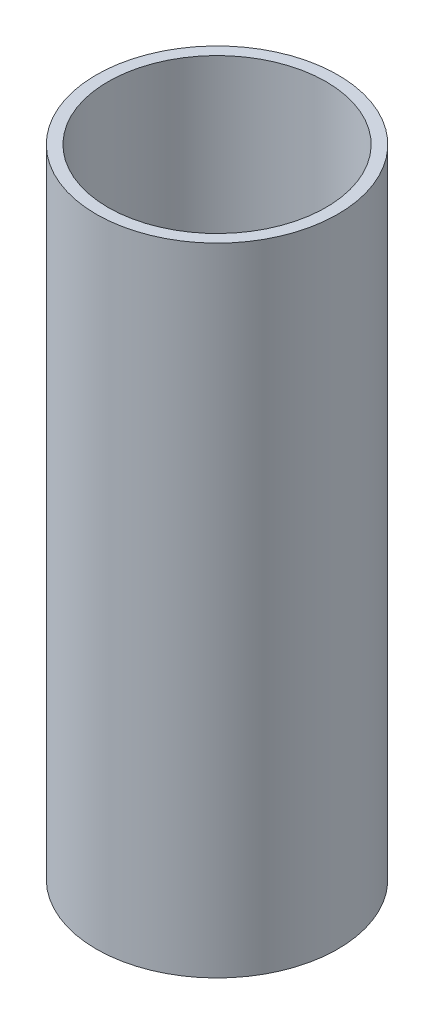
ISO-10303-21;
HEADER;
FILE_DESCRIPTION(('STEP AP214'),'2;1');
FILE_NAME('part.step','',(''),(''),'','','');
FILE_SCHEMA(('AUTOMOTIVE_DESIGN { 1 0 10303 214 1 1 1 1 }'));
ENDSEC;
DATA;
#1=APPLICATION_CONTEXT('core data for automotive mechanical design processes');
#2=APPLICATION_PROTOCOL_DEFINITION('international standard','automotive_design',2000,#1);
#3=PRODUCT_CONTEXT('',#1,'mechanical');
#4=PRODUCT('Part','Part','',(#3));
#5=PRODUCT_RELATED_PRODUCT_CATEGORY('part','',(#4));
#6=PRODUCT_DEFINITION_FORMATION('','',#4);
#7=PRODUCT_DEFINITION_CONTEXT('part definition',#1,'design');
#8=PRODUCT_DEFINITION('design','',#6,#7);
#9=PRODUCT_DEFINITION_SHAPE('','',#8);
#10=(LENGTH_UNIT() NAMED_UNIT(*) SI_UNIT(.MILLI.,.METRE.));
#11=(NAMED_UNIT(*) PLANE_ANGLE_UNIT() SI_UNIT($,.RADIAN.));
#12=(NAMED_UNIT(*) SI_UNIT($,.STERADIAN.) SOLID_ANGLE_UNIT());
#13=UNCERTAINTY_MEASURE_WITH_UNIT(LENGTH_MEASURE(1.E-05),#10,'distance_accuracy_value','');
#14=(GEOMETRIC_REPRESENTATION_CONTEXT(3) GLOBAL_UNCERTAINTY_ASSIGNED_CONTEXT((#13)) GLOBAL_UNIT_ASSIGNED_CONTEXT((#10,
#11,#12)) REPRESENTATION_CONTEXT('',''));
#15=CARTESIAN_POINT('',(0.,0.,0.));
#16=DIRECTION('',(0.,0.,1.));
#17=DIRECTION('',(1.,0.,0.));
#18=AXIS2_PLACEMENT_3D('',#15,#16,#17);
#19=CARTESIAN_POINT('',(0.,101.6,0.));
#20=DIRECTION('',(0.,1.,0.));
#21=DIRECTION('',(0.,0.,1.));
#22=AXIS2_PLACEMENT_3D('',#19,#20,#21);
#23=PLANE('',#22);
#24=CARTESIAN_POINT('',(0.,101.6,0.));
#25=DIRECTION('',(0.,1.,0.));
#26=DIRECTION('',(0.,0.,1.));
#27=AXIS2_PLACEMENT_3D('',#24,#25,#26);
#28=CIRCLE('',#27,19.2786);
#29=CARTESIAN_POINT('',(0.,101.6,19.2786));
#30=VERTEX_POINT('',#29);
#31=EDGE_CURVE('E10',#30,#30,#28,.T.);
#32=ORIENTED_EDGE('',*,*,#31,.T.);
#33=EDGE_LOOP('',(#32));
#34=FACE_BOUND('',#33,.T.);
#35=CARTESIAN_POINT('',(0.,101.6,0.));
#36=DIRECTION('',(0.,1.,0.));
#37=DIRECTION('',(0.,0.,1.));
#38=AXIS2_PLACEMENT_3D('',#35,#36,#37);
#39=CIRCLE('',#38,17.399);
#40=CARTESIAN_POINT('',(0.,101.6,17.399));
#41=VERTEX_POINT('',#40);
#42=EDGE_CURVE('E42',#41,#41,#39,.T.);
#43=ORIENTED_EDGE('',*,*,#42,.F.);
#44=EDGE_LOOP('',(#43));
#45=FACE_BOUND('',#44,.T.);
#46=ADVANCED_FACE('F31',(#34,#45),#23,.T.);
#47=CARTESIAN_POINT('',(0.,0.,0.));
#48=DIRECTION('',(0.,1.,0.));
#49=DIRECTION('',(0.,0.,1.));
#50=AXIS2_PLACEMENT_3D('',#47,#48,#49);
#51=PLANE('',#50);
#52=CARTESIAN_POINT('',(0.,0.,0.));
#53=DIRECTION('',(0.,1.,0.));
#54=DIRECTION('',(0.,0.,1.));
#55=AXIS2_PLACEMENT_3D('',#52,#53,#54);
#56=CIRCLE('',#55,19.2786);
#57=CARTESIAN_POINT('',(0.,0.,19.2786));
#58=VERTEX_POINT('',#57);
#59=EDGE_CURVE('E35',#58,#58,#56,.T.);
#60=ORIENTED_EDGE('',*,*,#59,.F.);
#61=EDGE_LOOP('',(#60));
#62=FACE_BOUND('',#61,.T.);
#63=CARTESIAN_POINT('',(0.,0.,0.));
#64=DIRECTION('',(0.,1.,0.));
#65=DIRECTION('',(0.,0.,1.));
#66=AXIS2_PLACEMENT_3D('',#63,#64,#65);
#67=CIRCLE('',#66,17.399);
#68=CARTESIAN_POINT('',(0.,0.,17.399));
#69=VERTEX_POINT('',#68);
#70=EDGE_CURVE('E44',#69,#69,#67,.T.);
#71=ORIENTED_EDGE('',*,*,#70,.T.);
#72=EDGE_LOOP('',(#71));
#73=FACE_BOUND('',#72,.T.);
#74=ADVANCED_FACE('F54',(#62,#73),#51,.F.);
#75=CARTESIAN_POINT('',(0.,101.6,0.));
#76=DIRECTION('',(0.,-1.,0.));
#77=DIRECTION('',(0.,0.,-1.));
#78=AXIS2_PLACEMENT_3D('',#75,#76,#77);
#79=CYLINDRICAL_SURFACE('',#78,19.2786);
#80=ORIENTED_EDGE('',*,*,#31,.F.);
#81=EDGE_LOOP('',(#80));
#82=FACE_BOUND('',#81,.T.);
#83=ORIENTED_EDGE('',*,*,#59,.T.);
#84=EDGE_LOOP('',(#83));
#85=FACE_BOUND('',#84,.T.);
#86=ADVANCED_FACE('F33',(#82,#85),#79,.T.);
#87=CARTESIAN_POINT('',(0.,101.6,0.));
#88=DIRECTION('',(0.,-1.,0.));
#89=DIRECTION('',(0.,0.,-1.));
#90=AXIS2_PLACEMENT_3D('',#87,#88,#89);
#91=CYLINDRICAL_SURFACE('',#90,17.399);
#92=ORIENTED_EDGE('',*,*,#42,.T.);
#93=EDGE_LOOP('',(#92));
#94=FACE_BOUND('',#93,.T.);
#95=ORIENTED_EDGE('',*,*,#70,.F.);
#96=EDGE_LOOP('',(#95));
#97=FACE_BOUND('',#96,.T.);
#98=ADVANCED_FACE('F50',(#94,#97),#91,.F.);
#99=CLOSED_SHELL('',(#46,#74,#86,#98));
#100=MANIFOLD_SOLID_BREP('B2',#99);
#101=ADVANCED_BREP_SHAPE_REPRESENTATION('',(#18,#100),#14);
#102=SHAPE_DEFINITION_REPRESENTATION(#9,#101);
ENDSEC;
END-ISO-10303-21;
